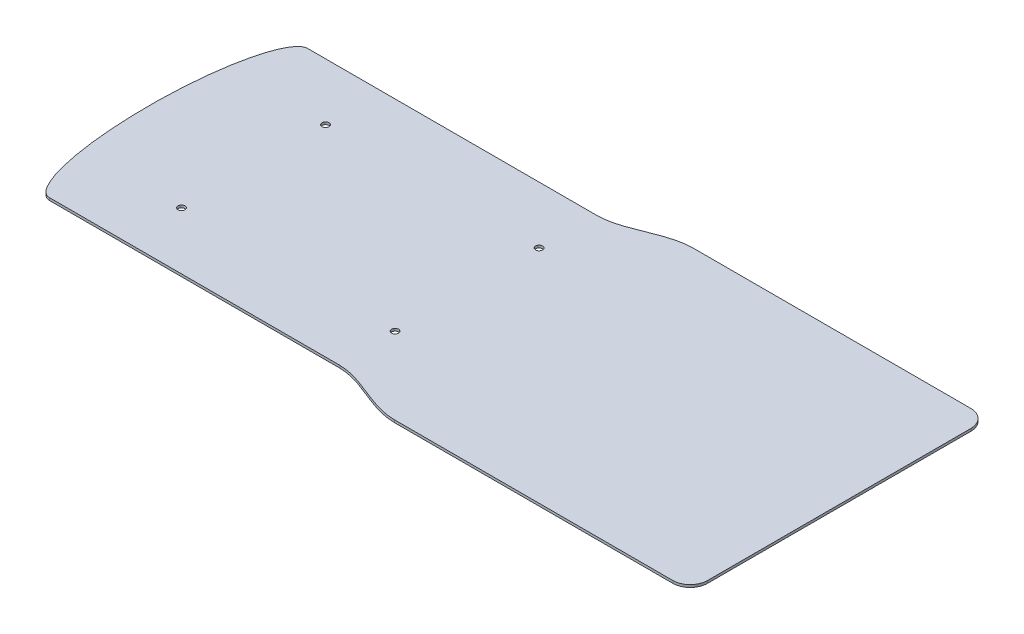
ISO-10303-21;
HEADER;
FILE_DESCRIPTION(('STEP AP214'),'2;1');
FILE_NAME('part.step','',(''),(''),'','','');
FILE_SCHEMA(('AUTOMOTIVE_DESIGN { 1 0 10303 214 1 1 1 1 }'));
ENDSEC;
DATA;
#1=APPLICATION_CONTEXT('core data for automotive mechanical design processes');
#2=APPLICATION_PROTOCOL_DEFINITION('international standard','automotive_design',2000,#1);
#3=PRODUCT_CONTEXT('',#1,'mechanical');
#4=PRODUCT('Part','Part','',(#3));
#5=PRODUCT_RELATED_PRODUCT_CATEGORY('part','',(#4));
#6=PRODUCT_DEFINITION_FORMATION('','',#4);
#7=PRODUCT_DEFINITION_CONTEXT('part definition',#1,'design');
#8=PRODUCT_DEFINITION('design','',#6,#7);
#9=PRODUCT_DEFINITION_SHAPE('','',#8);
#10=(LENGTH_UNIT() NAMED_UNIT(*) SI_UNIT(.MILLI.,.METRE.));
#11=(NAMED_UNIT(*) PLANE_ANGLE_UNIT() SI_UNIT($,.RADIAN.));
#12=(NAMED_UNIT(*) SI_UNIT($,.STERADIAN.) SOLID_ANGLE_UNIT());
#13=UNCERTAINTY_MEASURE_WITH_UNIT(LENGTH_MEASURE(1.E-05),#10,'distance_accuracy_value','');
#14=(GEOMETRIC_REPRESENTATION_CONTEXT(3) GLOBAL_UNCERTAINTY_ASSIGNED_CONTEXT((#13)) GLOBAL_UNIT_ASSIGNED_CONTEXT((#10,
#11,#12)) REPRESENTATION_CONTEXT('',''));
#15=CARTESIAN_POINT('',(0.,0.,0.));
#16=DIRECTION('',(0.,0.,1.));
#17=DIRECTION('',(1.,0.,0.));
#18=AXIS2_PLACEMENT_3D('',#15,#16,#17);
#19=CARTESIAN_POINT('',(139.,1.,-60.));
#20=DIRECTION('',(-1.,0.,0.));
#21=DIRECTION('',(0.,0.,1.));
#22=AXIS2_PLACEMENT_3D('',#19,#20,#21);
#23=PLANE('',#22);
#24=DIRECTION('',(0.,1.,0.));
#25=VECTOR('',#24,1.);
#26=CARTESIAN_POINT('',(139.,0.,-53.));
#27=LINE('',#26,#25);
#28=CARTESIAN_POINT('',(139.,0.,-53.));
#29=VERTEX_POINT('',#28);
#30=CARTESIAN_POINT('',(139.,1.,-53.));
#31=VERTEX_POINT('',#30);
#32=EDGE_CURVE('E122',#29,#31,#27,.T.);
#33=ORIENTED_EDGE('',*,*,#32,.T.);
#34=DIRECTION('',(0.,0.,-1.));
#35=VECTOR('',#34,1.);
#36=CARTESIAN_POINT('',(139.,1.,-60.));
#37=LINE('',#36,#35);
#38=CARTESIAN_POINT('',(139.,1.,53.));
#39=VERTEX_POINT('',#38);
#40=EDGE_CURVE('E153',#39,#31,#37,.T.);
#41=ORIENTED_EDGE('',*,*,#40,.F.);
#42=DIRECTION('',(0.,1.,0.));
#43=VECTOR('',#42,1.);
#44=CARTESIAN_POINT('',(139.,0.,53.));
#45=LINE('',#44,#43);
#46=CARTESIAN_POINT('',(139.,0.,53.));
#47=VERTEX_POINT('',#46);
#48=EDGE_CURVE('E142',#47,#39,#45,.T.);
#49=ORIENTED_EDGE('',*,*,#48,.F.);
#50=DIRECTION('',(0.,0.,-1.));
#51=VECTOR('',#50,1.);
#52=CARTESIAN_POINT('',(139.,0.,-60.));
#53=LINE('',#52,#51);
#54=EDGE_CURVE('E137',#47,#29,#53,.T.);
#55=ORIENTED_EDGE('',*,*,#54,.T.);
#56=EDGE_LOOP('',(#33,#41,#49,#55));
#57=FACE_BOUND('',#56,.T.);
#58=ADVANCED_FACE('F46',(#57),#23,.F.);
#59=CARTESIAN_POINT('',(-139.,1.,60.));
#60=DIRECTION('',(0.,0.,-1.));
#61=DIRECTION('',(-1.,0.,0.));
#62=AXIS2_PLACEMENT_3D('',#59,#60,#61);
#63=PLANE('',#62);
#64=DIRECTION('',(0.,1.,0.));
#65=VECTOR('',#64,1.);
#66=CARTESIAN_POINT('',(132.,0.,60.));
#67=LINE('',#66,#65);
#68=CARTESIAN_POINT('',(132.,0.,60.));
#69=VERTEX_POINT('',#68);
#70=CARTESIAN_POINT('',(132.,1.,60.));
#71=VERTEX_POINT('',#70);
#72=EDGE_CURVE('E167',#69,#71,#67,.T.);
#73=ORIENTED_EDGE('',*,*,#72,.T.);
#74=DIRECTION('',(1.,0.,0.));
#75=VECTOR('',#74,1.);
#76=CARTESIAN_POINT('',(-139.,1.,60.));
#77=LINE('',#76,#75);
#78=CARTESIAN_POINT('',(20.,1.,60.));
#79=VERTEX_POINT('',#78);
#80=EDGE_CURVE('E11',#79,#71,#77,.T.);
#81=ORIENTED_EDGE('',*,*,#80,.F.);
#82=DIRECTION('',(0.,1.,0.));
#83=VECTOR('',#82,1.);
#84=CARTESIAN_POINT('',(20.,0.,60.));
#85=LINE('',#84,#83);
#86=CARTESIAN_POINT('',(20.,0.,60.));
#87=VERTEX_POINT('',#86);
#88=EDGE_CURVE('E211',#87,#79,#85,.T.);
#89=ORIENTED_EDGE('',*,*,#88,.F.);
#90=DIRECTION('',(1.,0.,0.));
#91=VECTOR('',#90,1.);
#92=CARTESIAN_POINT('',(-139.,0.,60.));
#93=LINE('',#92,#91);
#94=EDGE_CURVE('E145',#87,#69,#93,.T.);
#95=ORIENTED_EDGE('',*,*,#94,.T.);
#96=EDGE_LOOP('',(#73,#81,#89,#95));
#97=FACE_BOUND('',#96,.T.);
#98=ADVANCED_FACE('F275',(#97),#63,.F.);
#99=CARTESIAN_POINT('',(0.,1.,0.));
#100=DIRECTION('',(0.,1.,0.));
#101=DIRECTION('',(0.,0.,1.));
#102=AXIS2_PLACEMENT_3D('',#99,#100,#101);
#103=PLANE('',#102);
#104=CARTESIAN_POINT('',(-96.85109,1.,28.96802));
#105=DIRECTION('',(0.,1.,0.));
#106=DIRECTION('',(0.,0.,1.));
#107=AXIS2_PLACEMENT_3D('',#104,#105,#106);
#108=CIRCLE('',#107,1.39979);
#109=CARTESIAN_POINT('',(-96.85109,1.,30.36781));
#110=VERTEX_POINT('',#109);
#111=EDGE_CURVE('E260',#110,#110,#108,.T.);
#112=ORIENTED_EDGE('',*,*,#111,.F.);
#113=EDGE_LOOP('',(#112));
#114=FACE_BOUND('',#113,.T.);
#115=CARTESIAN_POINT('',(-10.85223,1.,-29.03265));
#116=DIRECTION('',(0.,1.,0.));
#117=DIRECTION('',(0.,0.,1.));
#118=AXIS2_PLACEMENT_3D('',#115,#116,#117);
#119=CIRCLE('',#118,1.39979);
#120=CARTESIAN_POINT('',(-10.85223,1.,-27.63286));
#121=VERTEX_POINT('',#120);
#122=EDGE_CURVE('E261',#121,#121,#119,.T.);
#123=ORIENTED_EDGE('',*,*,#122,.F.);
#124=EDGE_LOOP('',(#123));
#125=FACE_BOUND('',#124,.T.);
#126=CARTESIAN_POINT('',(-10.8511,1.,28.96784));
#127=DIRECTION('',(0.,1.,0.));
#128=DIRECTION('',(0.,0.,1.));
#129=AXIS2_PLACEMENT_3D('',#126,#127,#128);
#130=CIRCLE('',#129,1.39979);
#131=CARTESIAN_POINT('',(-10.8511,1.,30.36763));
#132=VERTEX_POINT('',#131);
#133=EDGE_CURVE('E264',#132,#132,#130,.T.);
#134=ORIENTED_EDGE('',*,*,#133,.F.);
#135=EDGE_LOOP('',(#134));
#136=FACE_BOUND('',#135,.T.);
#137=CARTESIAN_POINT('',(-96.85129,1.,-29.0311));
#138=DIRECTION('',(0.,1.,0.));
#139=DIRECTION('',(0.,0.,1.));
#140=AXIS2_PLACEMENT_3D('',#137,#138,#139);
#141=CIRCLE('',#140,1.39978999999999);
#142=CARTESIAN_POINT('',(-96.85129,1.,-27.63131));
#143=VERTEX_POINT('',#142);
#144=EDGE_CURVE('E158',#143,#143,#141,.T.);
#145=ORIENTED_EDGE('',*,*,#144,.F.);
#146=EDGE_LOOP('',(#145));
#147=FACE_BOUND('',#146,.T.);
#148=CARTESIAN_POINT('',(132.,1.,-53.));
#149=DIRECTION('',(0.,-1.,0.));
#150=DIRECTION('',(0.,0.,1.));
#151=AXIS2_PLACEMENT_3D('',#148,#149,#150);
#152=CIRCLE('',#151,7.00000000000001);
#153=CARTESIAN_POINT('',(132.,1.,-60.));
#154=VERTEX_POINT('',#153);
#155=EDGE_CURVE('E125',#154,#31,#152,.T.);
#156=ORIENTED_EDGE('',*,*,#155,.F.);
#157=DIRECTION('',(-1.,0.,0.));
#158=VECTOR('',#157,1.);
#159=CARTESIAN_POINT('',(-139.,1.,-60.));
#160=LINE('',#159,#158);
#161=CARTESIAN_POINT('',(20.,1.,-60.));
#162=VERTEX_POINT('',#161);
#163=EDGE_CURVE('E54',#154,#162,#160,.T.);
#164=ORIENTED_EDGE('',*,*,#163,.T.);
#165=CARTESIAN_POINT('',(-10.,1.,-52.));
#166=CARTESIAN_POINT('',(0.641218660403758,1.,-52.3672232546946));
#167=CARTESIAN_POINT('',(9.37669372133116,1.,-59.9199275905152));
#168=CARTESIAN_POINT('',(20.,1.,-60.));
#169=B_SPLINE_CURVE_WITH_KNOTS('',3,(#165,#166,#167,#168),.UNSPECIFIED.,.F.,.F.,(4,4),(0.,1.),.UNSPECIFIED.);
#170=CARTESIAN_POINT('',(-10.,1.,-52.));
#171=VERTEX_POINT('',#170);
#172=EDGE_CURVE('E180',#171,#162,#169,.T.);
#173=ORIENTED_EDGE('',*,*,#172,.F.);
#174=DIRECTION('',(1.,0.,0.));
#175=VECTOR('',#174,1.);
#176=CARTESIAN_POINT('',(-10.,1.,-52.));
#177=LINE('',#176,#175);
#178=CARTESIAN_POINT('',(-127.,1.,-52.));
#179=VERTEX_POINT('',#178);
#180=EDGE_CURVE('E231',#179,#171,#177,.T.);
#181=ORIENTED_EDGE('',*,*,#180,.F.);
#182=CARTESIAN_POINT('',(-127.,1.,0.));
#183=DIRECTION('',(0.,1.,0.));
#184=DIRECTION('',(0.,0.,1.));
#185=AXIS2_PLACEMENT_3D('',#182,#183,#184);
#186=ELLIPSE('',#185,52.,12.);
#187=CARTESIAN_POINT('',(-127.,1.,52.));
#188=VERTEX_POINT('',#187);
#189=EDGE_CURVE('E220',#179,#188,#186,.T.);
#190=ORIENTED_EDGE('',*,*,#189,.T.);
#191=DIRECTION('',(-1.,0.,0.));
#192=VECTOR('',#191,1.);
#193=CARTESIAN_POINT('',(-139.,1.,52.));
#194=LINE('',#193,#192);
#195=CARTESIAN_POINT('',(-10.,1.,52.));
#196=VERTEX_POINT('',#195);
#197=EDGE_CURVE('E233',#196,#188,#194,.T.);
#198=ORIENTED_EDGE('',*,*,#197,.F.);
#199=CARTESIAN_POINT('',(20.,1.,60.));
#200=CARTESIAN_POINT('',(9.37669372133118,1.,59.9199275905152));
#201=CARTESIAN_POINT('',(0.641218660403772,1.,52.3672232546946));
#202=CARTESIAN_POINT('',(-10.,1.,52.));
#203=B_SPLINE_CURVE_WITH_KNOTS('',3,(#199,#200,#201,#202),.UNSPECIFIED.,.F.,.F.,(4,4),(0.,1.),.UNSPECIFIED.);
#204=EDGE_CURVE('E210',#79,#196,#203,.T.);
#205=ORIENTED_EDGE('',*,*,#204,.F.);
#206=ORIENTED_EDGE('',*,*,#80,.T.);
#207=CARTESIAN_POINT('',(132.,1.,53.));
#208=DIRECTION('',(0.,-1.,0.));
#209=DIRECTION('',(0.,0.,-1.));
#210=AXIS2_PLACEMENT_3D('',#207,#208,#209);
#211=CIRCLE('',#210,7.00000000000001);
#212=EDGE_CURVE('E70',#39,#71,#211,.T.);
#213=ORIENTED_EDGE('',*,*,#212,.F.);
#214=ORIENTED_EDGE('',*,*,#40,.T.);
#215=EDGE_LOOP('',(#156,#164,#173,#181,#190,#198,#205,#206,#213,#214));
#216=FACE_BOUND('',#215,.T.);
#217=ADVANCED_FACE('F246',(#114,#125,#136,#147,#216),#103,.T.);
#218=CARTESIAN_POINT('',(0.,0.,0.));
#219=DIRECTION('',(0.,1.,0.));
#220=DIRECTION('',(0.,0.,1.));
#221=AXIS2_PLACEMENT_3D('',#218,#219,#220);
#222=PLANE('',#221);
#223=CARTESIAN_POINT('',(-96.85109,0.,28.96802));
#224=DIRECTION('',(0.,1.,0.));
#225=DIRECTION('',(0.,0.,1.));
#226=AXIS2_PLACEMENT_3D('',#223,#224,#225);
#227=CIRCLE('',#226,1.39979);
#228=CARTESIAN_POINT('',(-96.85109,0.,30.36781));
#229=VERTEX_POINT('',#228);
#230=EDGE_CURVE('E49',#229,#229,#227,.T.);
#231=ORIENTED_EDGE('',*,*,#230,.T.);
#232=EDGE_LOOP('',(#231));
#233=FACE_BOUND('',#232,.T.);
#234=CARTESIAN_POINT('',(-10.85223,0.,-29.03265));
#235=DIRECTION('',(0.,1.,0.));
#236=DIRECTION('',(0.,0.,1.));
#237=AXIS2_PLACEMENT_3D('',#234,#235,#236);
#238=CIRCLE('',#237,1.39979);
#239=CARTESIAN_POINT('',(-10.85223,0.,-27.63286));
#240=VERTEX_POINT('',#239);
#241=EDGE_CURVE('E160',#240,#240,#238,.T.);
#242=ORIENTED_EDGE('',*,*,#241,.T.);
#243=EDGE_LOOP('',(#242));
#244=FACE_BOUND('',#243,.T.);
#245=CARTESIAN_POINT('',(-10.8511,0.,28.96784));
#246=DIRECTION('',(0.,1.,0.));
#247=DIRECTION('',(0.,0.,1.));
#248=AXIS2_PLACEMENT_3D('',#245,#246,#247);
#249=CIRCLE('',#248,1.39979);
#250=CARTESIAN_POINT('',(-10.8511,0.,30.36763));
#251=VERTEX_POINT('',#250);
#252=EDGE_CURVE('E157',#251,#251,#249,.T.);
#253=ORIENTED_EDGE('',*,*,#252,.T.);
#254=EDGE_LOOP('',(#253));
#255=FACE_BOUND('',#254,.T.);
#256=CARTESIAN_POINT('',(-96.85129,0.,-29.0311));
#257=DIRECTION('',(0.,1.,0.));
#258=DIRECTION('',(0.,0.,1.));
#259=AXIS2_PLACEMENT_3D('',#256,#257,#258);
#260=CIRCLE('',#259,1.39978999999999);
#261=CARTESIAN_POINT('',(-96.85129,0.,-27.63131));
#262=VERTEX_POINT('',#261);
#263=EDGE_CURVE('E154',#262,#262,#260,.T.);
#264=ORIENTED_EDGE('',*,*,#263,.T.);
#265=EDGE_LOOP('',(#264));
#266=FACE_BOUND('',#265,.T.);
#267=DIRECTION('',(-1.,0.,0.));
#268=VECTOR('',#267,1.);
#269=CARTESIAN_POINT('',(-139.,0.,-60.));
#270=LINE('',#269,#268);
#271=CARTESIAN_POINT('',(132.,0.,-60.));
#272=VERTEX_POINT('',#271);
#273=CARTESIAN_POINT('',(20.,0.,-60.));
#274=VERTEX_POINT('',#273);
#275=EDGE_CURVE('E139',#272,#274,#270,.T.);
#276=ORIENTED_EDGE('',*,*,#275,.F.);
#277=CARTESIAN_POINT('',(132.,0.,-53.));
#278=DIRECTION('',(0.,-1.,0.));
#279=DIRECTION('',(0.,0.,1.));
#280=AXIS2_PLACEMENT_3D('',#277,#278,#279);
#281=CIRCLE('',#280,7.00000000000001);
#282=EDGE_CURVE('E62',#272,#29,#281,.T.);
#283=ORIENTED_EDGE('',*,*,#282,.T.);
#284=ORIENTED_EDGE('',*,*,#54,.F.);
#285=CARTESIAN_POINT('',(132.,0.,53.));
#286=DIRECTION('',(0.,-1.,0.));
#287=DIRECTION('',(0.,0.,-1.));
#288=AXIS2_PLACEMENT_3D('',#285,#286,#287);
#289=CIRCLE('',#288,7.00000000000001);
#290=EDGE_CURVE('E169',#47,#69,#289,.T.);
#291=ORIENTED_EDGE('',*,*,#290,.T.);
#292=ORIENTED_EDGE('',*,*,#94,.F.);
#293=CARTESIAN_POINT('',(20.,0.,60.));
#294=CARTESIAN_POINT('',(9.37669372133118,0.,59.9199275905152));
#295=CARTESIAN_POINT('',(0.641218660403772,0.,52.3672232546946));
#296=CARTESIAN_POINT('',(-10.,0.,52.));
#297=B_SPLINE_CURVE_WITH_KNOTS('',3,(#293,#294,#295,#296),.UNSPECIFIED.,.F.,.F.,(4,4),(0.,1.),.UNSPECIFIED.);
#298=CARTESIAN_POINT('',(-10.,0.,52.));
#299=VERTEX_POINT('',#298);
#300=EDGE_CURVE('E203',#87,#299,#297,.T.);
#301=ORIENTED_EDGE('',*,*,#300,.T.);
#302=DIRECTION('',(-1.,0.,0.));
#303=VECTOR('',#302,1.);
#304=CARTESIAN_POINT('',(-139.,0.,52.));
#305=LINE('',#304,#303);
#306=CARTESIAN_POINT('',(-127.,0.,52.));
#307=VERTEX_POINT('',#306);
#308=EDGE_CURVE('E237',#299,#307,#305,.T.);
#309=ORIENTED_EDGE('',*,*,#308,.T.);
#310=CARTESIAN_POINT('',(-127.,0.,0.));
#311=DIRECTION('',(0.,1.,0.));
#312=DIRECTION('',(0.,0.,1.));
#313=AXIS2_PLACEMENT_3D('',#310,#311,#312);
#314=ELLIPSE('',#313,52.,12.);
#315=CARTESIAN_POINT('',(-127.,0.,-52.));
#316=VERTEX_POINT('',#315);
#317=EDGE_CURVE('E221',#316,#307,#314,.T.);
#318=ORIENTED_EDGE('',*,*,#317,.F.);
#319=DIRECTION('',(1.,0.,0.));
#320=VECTOR('',#319,1.);
#321=CARTESIAN_POINT('',(-10.,0.,-52.));
#322=LINE('',#321,#320);
#323=CARTESIAN_POINT('',(-10.,0.,-52.));
#324=VERTEX_POINT('',#323);
#325=EDGE_CURVE('E147',#316,#324,#322,.T.);
#326=ORIENTED_EDGE('',*,*,#325,.T.);
#327=CARTESIAN_POINT('',(-10.,0.,-52.));
#328=CARTESIAN_POINT('',(0.641218660403758,0.,-52.3672232546946));
#329=CARTESIAN_POINT('',(9.37669372133116,0.,-59.9199275905152));
#330=CARTESIAN_POINT('',(20.,0.,-60.));
#331=B_SPLINE_CURVE_WITH_KNOTS('',3,(#327,#328,#329,#330),.UNSPECIFIED.,.F.,.F.,(4,4),(0.,1.),.UNSPECIFIED.);
#332=EDGE_CURVE('E174',#324,#274,#331,.T.);
#333=ORIENTED_EDGE('',*,*,#332,.T.);
#334=EDGE_LOOP('',(#276,#283,#284,#291,#292,#301,#309,#318,#326,#333));
#335=FACE_BOUND('',#334,.T.);
#336=ADVANCED_FACE('F135',(#233,#244,#255,#266,#335),#222,.F.);
#337=CARTESIAN_POINT('',(-139.,0.,52.));
#338=DIRECTION('',(0.,0.,-1.));
#339=DIRECTION('',(-1.,0.,0.));
#340=AXIS2_PLACEMENT_3D('',#337,#338,#339);
#341=PLANE('',#340);
#342=DIRECTION('',(0.,1.,0.));
#343=VECTOR('',#342,1.);
#344=CARTESIAN_POINT('',(-127.,0.,52.));
#345=LINE('',#344,#343);
#346=EDGE_CURVE('E215',#307,#188,#345,.T.);
#347=ORIENTED_EDGE('',*,*,#346,.F.);
#348=ORIENTED_EDGE('',*,*,#308,.F.);
#349=DIRECTION('',(0.,1.,0.));
#350=VECTOR('',#349,1.);
#351=CARTESIAN_POINT('',(-10.,0.,52.));
#352=LINE('',#351,#350);
#353=EDGE_CURVE('E228',#299,#196,#352,.T.);
#354=ORIENTED_EDGE('',*,*,#353,.T.);
#355=ORIENTED_EDGE('',*,*,#197,.T.);
#356=EDGE_LOOP('',(#347,#348,#354,#355));
#357=FACE_BOUND('',#356,.T.);
#358=ADVANCED_FACE('F287',(#357),#341,.F.);
#359=CARTESIAN_POINT('',(-139.,1.,-60.));
#360=DIRECTION('',(0.,0.,1.));
#361=DIRECTION('',(1.,0.,0.));
#362=AXIS2_PLACEMENT_3D('',#359,#360,#361);
#363=PLANE('',#362);
#364=ORIENTED_EDGE('',*,*,#163,.F.);
#365=DIRECTION('',(0.,1.,0.));
#366=VECTOR('',#365,1.);
#367=CARTESIAN_POINT('',(132.,0.,-60.));
#368=LINE('',#367,#366);
#369=EDGE_CURVE('E130',#272,#154,#368,.T.);
#370=ORIENTED_EDGE('',*,*,#369,.F.);
#371=ORIENTED_EDGE('',*,*,#275,.T.);
#372=DIRECTION('',(0.,1.,0.));
#373=VECTOR('',#372,1.);
#374=CARTESIAN_POINT('',(20.,0.,-60.));
#375=LINE('',#374,#373);
#376=EDGE_CURVE('E179',#274,#162,#375,.T.);
#377=ORIENTED_EDGE('',*,*,#376,.T.);
#378=EDGE_LOOP('',(#364,#370,#371,#377));
#379=FACE_BOUND('',#378,.T.);
#380=ADVANCED_FACE('F252',(#379),#363,.F.);
#381=CARTESIAN_POINT('',(-10.,0.,-52.));
#382=DIRECTION('',(0.,0.,1.));
#383=DIRECTION('',(1.,0.,0.));
#384=AXIS2_PLACEMENT_3D('',#381,#382,#383);
#385=PLANE('',#384);
#386=ORIENTED_EDGE('',*,*,#325,.F.);
#387=DIRECTION('',(0.,1.,0.));
#388=VECTOR('',#387,1.);
#389=CARTESIAN_POINT('',(-127.,0.,-52.));
#390=LINE('',#389,#388);
#391=EDGE_CURVE('E224',#316,#179,#390,.T.);
#392=ORIENTED_EDGE('',*,*,#391,.T.);
#393=ORIENTED_EDGE('',*,*,#180,.T.);
#394=DIRECTION('',(0.,1.,0.));
#395=VECTOR('',#394,1.);
#396=CARTESIAN_POINT('',(-10.,0.,-52.));
#397=LINE('',#396,#395);
#398=EDGE_CURVE('E143',#324,#171,#397,.T.);
#399=ORIENTED_EDGE('',*,*,#398,.F.);
#400=EDGE_LOOP('',(#386,#392,#393,#399));
#401=FACE_BOUND('',#400,.T.);
#402=ADVANCED_FACE('F305',(#401),#385,.F.);
#403=DIRECTION('',(0.,1.,0.));
#404=VECTOR('',#403,1.);
#405=SURFACE_OF_LINEAR_EXTRUSION('',#314,#404);
#406=ORIENTED_EDGE('',*,*,#189,.F.);
#407=ORIENTED_EDGE('',*,*,#391,.F.);
#408=ORIENTED_EDGE('',*,*,#317,.T.);
#409=ORIENTED_EDGE('',*,*,#346,.T.);
#410=EDGE_LOOP('',(#406,#407,#408,#409));
#411=FACE_BOUND('',#410,.T.);
#412=ADVANCED_FACE('F193',(#411),#405,.T.);
#413=DIRECTION('',(0.,1.,0.));
#414=VECTOR('',#413,1.);
#415=SURFACE_OF_LINEAR_EXTRUSION('',#331,#414);
#416=ORIENTED_EDGE('',*,*,#172,.T.);
#417=ORIENTED_EDGE('',*,*,#376,.F.);
#418=ORIENTED_EDGE('',*,*,#332,.F.);
#419=ORIENTED_EDGE('',*,*,#398,.T.);
#420=EDGE_LOOP('',(#416,#417,#418,#419));
#421=FACE_BOUND('',#420,.T.);
#422=ADVANCED_FACE('F188',(#421),#415,.F.);
#423=DIRECTION('',(0.,1.,0.));
#424=VECTOR('',#423,1.);
#425=SURFACE_OF_LINEAR_EXTRUSION('',#297,#424);
#426=ORIENTED_EDGE('',*,*,#204,.T.);
#427=ORIENTED_EDGE('',*,*,#353,.F.);
#428=ORIENTED_EDGE('',*,*,#300,.F.);
#429=ORIENTED_EDGE('',*,*,#88,.T.);
#430=EDGE_LOOP('',(#426,#427,#428,#429));
#431=FACE_BOUND('',#430,.T.);
#432=ADVANCED_FACE('F192',(#431),#425,.F.);
#433=CARTESIAN_POINT('',(132.,0.,53.));
#434=DIRECTION('',(0.,1.,0.));
#435=DIRECTION('',(0.,0.,1.));
#436=AXIS2_PLACEMENT_3D('',#433,#434,#435);
#437=CYLINDRICAL_SURFACE('',#436,7.00000000000001);
#438=ORIENTED_EDGE('',*,*,#212,.T.);
#439=ORIENTED_EDGE('',*,*,#72,.F.);
#440=ORIENTED_EDGE('',*,*,#290,.F.);
#441=ORIENTED_EDGE('',*,*,#48,.T.);
#442=EDGE_LOOP('',(#438,#439,#440,#441));
#443=FACE_BOUND('',#442,.T.);
#444=ADVANCED_FACE('F195',(#443),#437,.T.);
#445=CARTESIAN_POINT('',(132.,0.,-53.));
#446=DIRECTION('',(0.,1.,0.));
#447=DIRECTION('',(0.,0.,1.));
#448=AXIS2_PLACEMENT_3D('',#445,#446,#447);
#449=CYLINDRICAL_SURFACE('',#448,7.00000000000001);
#450=ORIENTED_EDGE('',*,*,#155,.T.);
#451=ORIENTED_EDGE('',*,*,#32,.F.);
#452=ORIENTED_EDGE('',*,*,#282,.F.);
#453=ORIENTED_EDGE('',*,*,#369,.T.);
#454=EDGE_LOOP('',(#450,#451,#452,#453));
#455=FACE_BOUND('',#454,.T.);
#456=ADVANCED_FACE('F123',(#455),#449,.T.);
#457=CARTESIAN_POINT('',(-96.85129,-9.,-29.0311));
#458=DIRECTION('',(0.,1.,0.));
#459=DIRECTION('',(0.,0.,1.));
#460=AXIS2_PLACEMENT_3D('',#457,#458,#459);
#461=CYLINDRICAL_SURFACE('',#460,1.39978999999999);
#462=ORIENTED_EDGE('',*,*,#144,.T.);
#463=EDGE_LOOP('',(#462));
#464=FACE_BOUND('',#463,.T.);
#465=ORIENTED_EDGE('',*,*,#263,.F.);
#466=EDGE_LOOP('',(#465));
#467=FACE_BOUND('',#466,.T.);
#468=ADVANCED_FACE('F280',(#464,#467),#461,.F.);
#469=CARTESIAN_POINT('',(-10.8511,-9.,28.96784));
#470=DIRECTION('',(0.,1.,0.));
#471=DIRECTION('',(0.,0.,1.));
#472=AXIS2_PLACEMENT_3D('',#469,#470,#471);
#473=CYLINDRICAL_SURFACE('',#472,1.39979);
#474=ORIENTED_EDGE('',*,*,#133,.T.);
#475=EDGE_LOOP('',(#474));
#476=FACE_BOUND('',#475,.T.);
#477=ORIENTED_EDGE('',*,*,#252,.F.);
#478=EDGE_LOOP('',(#477));
#479=FACE_BOUND('',#478,.T.);
#480=ADVANCED_FACE('F270',(#476,#479),#473,.F.);
#481=CARTESIAN_POINT('',(-10.85223,-9.,-29.03265));
#482=DIRECTION('',(0.,1.,0.));
#483=DIRECTION('',(0.,0.,1.));
#484=AXIS2_PLACEMENT_3D('',#481,#482,#483);
#485=CYLINDRICAL_SURFACE('',#484,1.39979);
#486=ORIENTED_EDGE('',*,*,#122,.T.);
#487=EDGE_LOOP('',(#486));
#488=FACE_BOUND('',#487,.T.);
#489=ORIENTED_EDGE('',*,*,#241,.F.);
#490=EDGE_LOOP('',(#489));
#491=FACE_BOUND('',#490,.T.);
#492=ADVANCED_FACE('F329',(#488,#491),#485,.F.);
#493=CARTESIAN_POINT('',(-96.85109,-9.,28.96802));
#494=DIRECTION('',(0.,1.,0.));
#495=DIRECTION('',(0.,0.,1.));
#496=AXIS2_PLACEMENT_3D('',#493,#494,#495);
#497=CYLINDRICAL_SURFACE('',#496,1.39979);
#498=ORIENTED_EDGE('',*,*,#111,.T.);
#499=EDGE_LOOP('',(#498));
#500=FACE_BOUND('',#499,.T.);
#501=ORIENTED_EDGE('',*,*,#230,.F.);
#502=EDGE_LOOP('',(#501));
#503=FACE_BOUND('',#502,.T.);
#504=ADVANCED_FACE('F332',(#500,#503),#497,.F.);
#505=CLOSED_SHELL('',(#58,#98,#217,#336,#358,#380,#402,#412,#422,#432,#444,#456,#468,#480,#492,#504));
#506=MANIFOLD_SOLID_BREP('B2',#505);
#507=ADVANCED_BREP_SHAPE_REPRESENTATION('',(#18,#506),#14);
#508=SHAPE_DEFINITION_REPRESENTATION(#9,#507);
ENDSEC;
END-ISO-10303-21;
